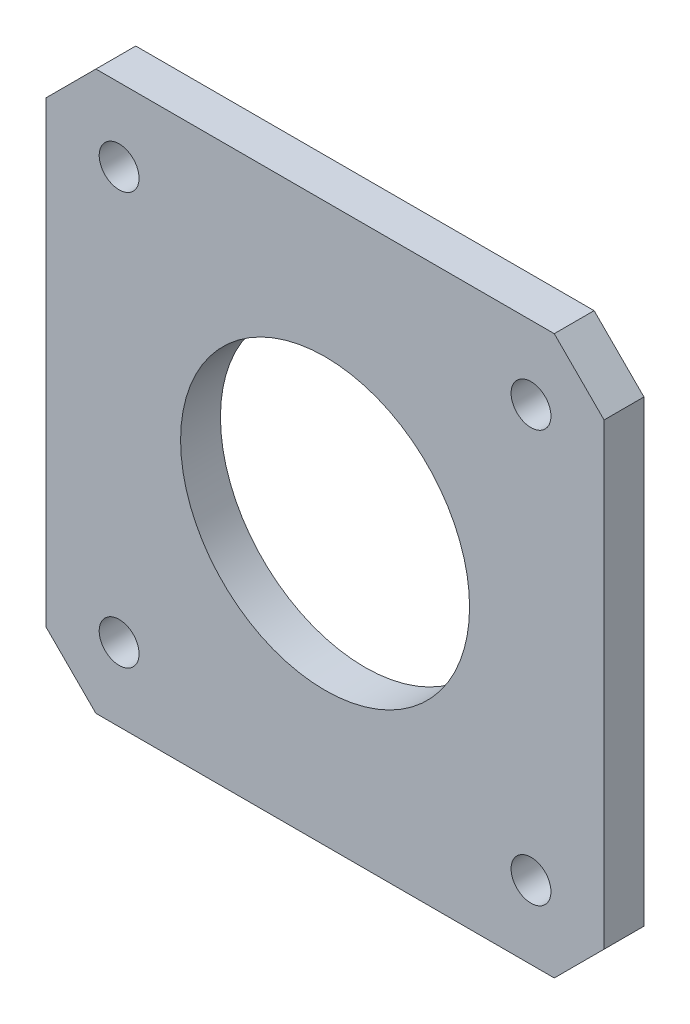
ISO-10303-21;
HEADER;
FILE_DESCRIPTION(('STEP AP214'),'2;1');
FILE_NAME('part.step','',(''),(''),'','','');
FILE_SCHEMA(('AUTOMOTIVE_DESIGN { 1 0 10303 214 1 1 1 1 }'));
ENDSEC;
DATA;
#1=APPLICATION_CONTEXT('core data for automotive mechanical design processes');
#2=APPLICATION_PROTOCOL_DEFINITION('international standard','automotive_design',2000,#1);
#3=PRODUCT_CONTEXT('',#1,'mechanical');
#4=PRODUCT('Part','Part','',(#3));
#5=PRODUCT_RELATED_PRODUCT_CATEGORY('part','',(#4));
#6=PRODUCT_DEFINITION_FORMATION('','',#4);
#7=PRODUCT_DEFINITION_CONTEXT('part definition',#1,'design');
#8=PRODUCT_DEFINITION('design','',#6,#7);
#9=PRODUCT_DEFINITION_SHAPE('','',#8);
#10=(LENGTH_UNIT() NAMED_UNIT(*) SI_UNIT(.MILLI.,.METRE.));
#11=(NAMED_UNIT(*) PLANE_ANGLE_UNIT() SI_UNIT($,.RADIAN.));
#12=(NAMED_UNIT(*) SI_UNIT($,.STERADIAN.) SOLID_ANGLE_UNIT());
#13=UNCERTAINTY_MEASURE_WITH_UNIT(LENGTH_MEASURE(1.E-05),#10,'distance_accuracy_value','');
#14=(GEOMETRIC_REPRESENTATION_CONTEXT(3) GLOBAL_UNCERTAINTY_ASSIGNED_CONTEXT((#13)) GLOBAL_UNIT_ASSIGNED_CONTEXT((#10,
#11,#12)) REPRESENTATION_CONTEXT('',''));
#15=CARTESIAN_POINT('',(0.,0.,0.));
#16=DIRECTION('',(0.,0.,1.));
#17=DIRECTION('',(1.,0.,0.));
#18=AXIS2_PLACEMENT_3D('',#15,#16,#17);
#19=CARTESIAN_POINT('',(0.,0.,3.));
#20=DIRECTION('',(0.,0.,1.));
#21=DIRECTION('',(1.,0.,0.));
#22=AXIS2_PLACEMENT_3D('',#19,#20,#21);
#23=PLANE('',#22);
#24=CARTESIAN_POINT('',(15.5000000000009,-15.4999999999991,3.));
#25=DIRECTION('',(0.,0.,1.));
#26=DIRECTION('',(1.,0.,0.));
#27=AXIS2_PLACEMENT_3D('',#24,#25,#26);
#28=CIRCLE('',#27,1.50000000000123);
#29=CARTESIAN_POINT('',(17.0000000000021,-15.4999999999991,3.));
#30=VERTEX_POINT('',#29);
#31=EDGE_CURVE('E186',#30,#30,#28,.T.);
#32=ORIENTED_EDGE('',*,*,#31,.F.);
#33=EDGE_LOOP('',(#32));
#34=FACE_BOUND('',#33,.T.);
#35=CARTESIAN_POINT('',(0.,0.,3.));
#36=DIRECTION('',(0.,0.,1.));
#37=DIRECTION('',(1.,0.,0.));
#38=AXIS2_PLACEMENT_3D('',#35,#36,#37);
#39=CIRCLE('',#38,10.875);
#40=CARTESIAN_POINT('',(10.875,0.,3.));
#41=VERTEX_POINT('',#40);
#42=EDGE_CURVE('E160',#41,#41,#39,.T.);
#43=ORIENTED_EDGE('',*,*,#42,.F.);
#44=EDGE_LOOP('',(#43));
#45=FACE_BOUND('',#44,.T.);
#46=DIRECTION('',(-1.,0.,0.));
#47=VECTOR('',#46,1.);
#48=CARTESIAN_POINT('',(-17.25,21.,3.));
#49=LINE('',#48,#47);
#50=CARTESIAN_POINT('',(17.25,21.,3.));
#51=VERTEX_POINT('',#50);
#52=CARTESIAN_POINT('',(-17.25,21.,3.));
#53=VERTEX_POINT('',#52);
#54=EDGE_CURVE('E161',#51,#53,#49,.T.);
#55=ORIENTED_EDGE('',*,*,#54,.T.);
#56=DIRECTION('',(-0.707106781186547,-0.707106781186547,0.));
#57=VECTOR('',#56,1.);
#58=CARTESIAN_POINT('',(-21.,17.25,3.));
#59=LINE('',#58,#57);
#60=CARTESIAN_POINT('',(-21.,17.25,3.));
#61=VERTEX_POINT('',#60);
#62=EDGE_CURVE('E98',#53,#61,#59,.T.);
#63=ORIENTED_EDGE('',*,*,#62,.T.);
#64=DIRECTION('',(0.,-1.,0.));
#65=VECTOR('',#64,1.);
#66=CARTESIAN_POINT('',(-21.,-17.25,3.));
#67=LINE('',#66,#65);
#68=CARTESIAN_POINT('',(-21.,-17.25,3.));
#69=VERTEX_POINT('',#68);
#70=EDGE_CURVE('E174',#61,#69,#67,.T.);
#71=ORIENTED_EDGE('',*,*,#70,.T.);
#72=DIRECTION('',(0.707106781186547,-0.707106781186547,0.));
#73=VECTOR('',#72,1.);
#74=CARTESIAN_POINT('',(-21.,-17.25,3.));
#75=LINE('',#74,#73);
#76=CARTESIAN_POINT('',(-17.25,-21.,3.));
#77=VERTEX_POINT('',#76);
#78=EDGE_CURVE('E177',#69,#77,#75,.T.);
#79=ORIENTED_EDGE('',*,*,#78,.T.);
#80=DIRECTION('',(1.,0.,0.));
#81=VECTOR('',#80,1.);
#82=CARTESIAN_POINT('',(-17.25,-21.,3.));
#83=LINE('',#82,#81);
#84=CARTESIAN_POINT('',(17.25,-21.,3.));
#85=VERTEX_POINT('',#84);
#86=EDGE_CURVE('E117',#77,#85,#83,.T.);
#87=ORIENTED_EDGE('',*,*,#86,.T.);
#88=DIRECTION('',(0.707106781186547,0.707106781186548,0.));
#89=VECTOR('',#88,1.);
#90=CARTESIAN_POINT('',(17.25,-21.,3.));
#91=LINE('',#90,#89);
#92=CARTESIAN_POINT('',(21.,-17.25,3.));
#93=VERTEX_POINT('',#92);
#94=EDGE_CURVE('E111',#85,#93,#91,.T.);
#95=ORIENTED_EDGE('',*,*,#94,.T.);
#96=DIRECTION('',(0.,1.,0.));
#97=VECTOR('',#96,1.);
#98=CARTESIAN_POINT('',(21.,-17.25,3.));
#99=LINE('',#98,#97);
#100=CARTESIAN_POINT('',(21.,17.25,3.));
#101=VERTEX_POINT('',#100);
#102=EDGE_CURVE('E115',#93,#101,#99,.T.);
#103=ORIENTED_EDGE('',*,*,#102,.T.);
#104=DIRECTION('',(-0.707106781186547,0.707106781186547,0.));
#105=VECTOR('',#104,1.);
#106=CARTESIAN_POINT('',(17.25,21.,3.));
#107=LINE('',#106,#105);
#108=EDGE_CURVE('E55',#101,#51,#107,.T.);
#109=ORIENTED_EDGE('',*,*,#108,.T.);
#110=EDGE_LOOP('',(#55,#63,#71,#79,#87,#95,#103,#109));
#111=FACE_BOUND('',#110,.T.);
#112=CARTESIAN_POINT('',(-15.5,15.5,3.));
#113=DIRECTION('',(0.,0.,1.));
#114=DIRECTION('',(1.,0.,0.));
#115=AXIS2_PLACEMENT_3D('',#112,#113,#114);
#116=CIRCLE('',#115,1.5);
#117=CARTESIAN_POINT('',(-14.,15.5,3.));
#118=VERTEX_POINT('',#117);
#119=EDGE_CURVE('E148',#118,#118,#116,.T.);
#120=ORIENTED_EDGE('',*,*,#119,.F.);
#121=EDGE_LOOP('',(#120));
#122=FACE_BOUND('',#121,.T.);
#123=CARTESIAN_POINT('',(15.5,15.5000000000009,3.));
#124=DIRECTION('',(0.,0.,1.));
#125=DIRECTION('',(1.,0.,0.));
#126=AXIS2_PLACEMENT_3D('',#123,#124,#125);
#127=CIRCLE('',#126,1.50000000000091);
#128=CARTESIAN_POINT('',(17.0000000000009,15.5000000000009,3.));
#129=VERTEX_POINT('',#128);
#130=EDGE_CURVE('E194',#129,#129,#127,.T.);
#131=ORIENTED_EDGE('',*,*,#130,.F.);
#132=EDGE_LOOP('',(#131));
#133=FACE_BOUND('',#132,.T.);
#134=CARTESIAN_POINT('',(-15.4999999999991,-15.5,3.));
#135=DIRECTION('',(0.,0.,1.));
#136=DIRECTION('',(1.,0.,0.));
#137=AXIS2_PLACEMENT_3D('',#134,#135,#136);
#138=CIRCLE('',#137,1.50000000000047);
#139=CARTESIAN_POINT('',(-13.9999999999986,-15.5,3.));
#140=VERTEX_POINT('',#139);
#141=EDGE_CURVE('E197',#140,#140,#138,.T.);
#142=ORIENTED_EDGE('',*,*,#141,.F.);
#143=EDGE_LOOP('',(#142));
#144=FACE_BOUND('',#143,.T.);
#145=ADVANCED_FACE('F38',(#34,#45,#111,#122,#133,#144),#23,.T.);
#146=CARTESIAN_POINT('',(0.,0.,0.));
#147=DIRECTION('',(0.,0.,1.));
#148=DIRECTION('',(1.,0.,0.));
#149=AXIS2_PLACEMENT_3D('',#146,#147,#148);
#150=PLANE('',#149);
#151=DIRECTION('',(-1.,0.,0.));
#152=VECTOR('',#151,1.);
#153=CARTESIAN_POINT('',(-17.25,21.,0.));
#154=LINE('',#153,#152);
#155=CARTESIAN_POINT('',(17.25,21.,0.));
#156=VERTEX_POINT('',#155);
#157=CARTESIAN_POINT('',(-17.25,21.,0.));
#158=VERTEX_POINT('',#157);
#159=EDGE_CURVE('E154',#156,#158,#154,.T.);
#160=ORIENTED_EDGE('',*,*,#159,.F.);
#161=DIRECTION('',(-0.707106781186547,0.707106781186547,0.));
#162=VECTOR('',#161,1.);
#163=CARTESIAN_POINT('',(17.25,21.,0.));
#164=LINE('',#163,#162);
#165=CARTESIAN_POINT('',(21.,17.25,0.));
#166=VERTEX_POINT('',#165);
#167=EDGE_CURVE('E90',#166,#156,#164,.T.);
#168=ORIENTED_EDGE('',*,*,#167,.F.);
#169=DIRECTION('',(0.,1.,0.));
#170=VECTOR('',#169,1.);
#171=CARTESIAN_POINT('',(21.,-17.25,0.));
#172=LINE('',#171,#170);
#173=CARTESIAN_POINT('',(21.,-17.25,0.));
#174=VERTEX_POINT('',#173);
#175=EDGE_CURVE('E84',#174,#166,#172,.T.);
#176=ORIENTED_EDGE('',*,*,#175,.F.);
#177=DIRECTION('',(0.707106781186547,0.707106781186548,0.));
#178=VECTOR('',#177,1.);
#179=CARTESIAN_POINT('',(17.25,-21.,0.));
#180=LINE('',#179,#178);
#181=CARTESIAN_POINT('',(17.25,-21.,0.));
#182=VERTEX_POINT('',#181);
#183=EDGE_CURVE('E126',#182,#174,#180,.T.);
#184=ORIENTED_EDGE('',*,*,#183,.F.);
#185=DIRECTION('',(1.,0.,0.));
#186=VECTOR('',#185,1.);
#187=CARTESIAN_POINT('',(-17.25,-21.,0.));
#188=LINE('',#187,#186);
#189=CARTESIAN_POINT('',(-17.25,-21.,0.));
#190=VERTEX_POINT('',#189);
#191=EDGE_CURVE('E280',#190,#182,#188,.T.);
#192=ORIENTED_EDGE('',*,*,#191,.F.);
#193=DIRECTION('',(0.707106781186547,-0.707106781186547,0.));
#194=VECTOR('',#193,1.);
#195=CARTESIAN_POINT('',(-21.,-17.25,0.));
#196=LINE('',#195,#194);
#197=CARTESIAN_POINT('',(-21.,-17.25,0.));
#198=VERTEX_POINT('',#197);
#199=EDGE_CURVE('E278',#198,#190,#196,.T.);
#200=ORIENTED_EDGE('',*,*,#199,.F.);
#201=DIRECTION('',(0.,-1.,0.));
#202=VECTOR('',#201,1.);
#203=CARTESIAN_POINT('',(-21.,-17.25,0.));
#204=LINE('',#203,#202);
#205=CARTESIAN_POINT('',(-21.,17.25,0.));
#206=VERTEX_POINT('',#205);
#207=EDGE_CURVE('E270',#206,#198,#204,.T.);
#208=ORIENTED_EDGE('',*,*,#207,.F.);
#209=DIRECTION('',(-0.707106781186547,-0.707106781186547,0.));
#210=VECTOR('',#209,1.);
#211=CARTESIAN_POINT('',(-21.,17.25,0.));
#212=LINE('',#211,#210);
#213=EDGE_CURVE('E263',#158,#206,#212,.T.);
#214=ORIENTED_EDGE('',*,*,#213,.F.);
#215=EDGE_LOOP('',(#160,#168,#176,#184,#192,#200,#208,#214));
#216=FACE_BOUND('',#215,.T.);
#217=CARTESIAN_POINT('',(-15.5,15.5,0.));
#218=DIRECTION('',(0.,0.,1.));
#219=DIRECTION('',(1.,0.,0.));
#220=AXIS2_PLACEMENT_3D('',#217,#218,#219);
#221=CIRCLE('',#220,1.5);
#222=CARTESIAN_POINT('',(-14.,15.5,0.));
#223=VERTEX_POINT('',#222);
#224=EDGE_CURVE('E155',#223,#223,#221,.T.);
#225=ORIENTED_EDGE('',*,*,#224,.T.);
#226=EDGE_LOOP('',(#225));
#227=FACE_BOUND('',#226,.T.);
#228=CARTESIAN_POINT('',(0.,0.,0.));
#229=DIRECTION('',(0.,0.,1.));
#230=DIRECTION('',(1.,0.,0.));
#231=AXIS2_PLACEMENT_3D('',#228,#229,#230);
#232=CIRCLE('',#231,10.875);
#233=CARTESIAN_POINT('',(10.875,0.,0.));
#234=VERTEX_POINT('',#233);
#235=EDGE_CURVE('E156',#234,#234,#232,.T.);
#236=ORIENTED_EDGE('',*,*,#235,.T.);
#237=EDGE_LOOP('',(#236));
#238=FACE_BOUND('',#237,.T.);
#239=CARTESIAN_POINT('',(15.5,15.5000000000009,0.));
#240=DIRECTION('',(0.,0.,1.));
#241=DIRECTION('',(1.,0.,0.));
#242=AXIS2_PLACEMENT_3D('',#239,#240,#241);
#243=CIRCLE('',#242,1.50000000000091);
#244=CARTESIAN_POINT('',(17.0000000000009,15.5000000000009,0.));
#245=VERTEX_POINT('',#244);
#246=EDGE_CURVE('E188',#245,#245,#243,.T.);
#247=ORIENTED_EDGE('',*,*,#246,.T.);
#248=EDGE_LOOP('',(#247));
#249=FACE_BOUND('',#248,.T.);
#250=CARTESIAN_POINT('',(15.5000000000009,-15.4999999999991,0.));
#251=DIRECTION('',(0.,0.,1.));
#252=DIRECTION('',(1.,0.,0.));
#253=AXIS2_PLACEMENT_3D('',#250,#251,#252);
#254=CIRCLE('',#253,1.50000000000123);
#255=CARTESIAN_POINT('',(17.0000000000021,-15.4999999999991,0.));
#256=VERTEX_POINT('',#255);
#257=EDGE_CURVE('E189',#256,#256,#254,.T.);
#258=ORIENTED_EDGE('',*,*,#257,.T.);
#259=EDGE_LOOP('',(#258));
#260=FACE_BOUND('',#259,.T.);
#261=CARTESIAN_POINT('',(-15.4999999999991,-15.5,0.));
#262=DIRECTION('',(0.,0.,1.));
#263=DIRECTION('',(1.,0.,0.));
#264=AXIS2_PLACEMENT_3D('',#261,#262,#263);
#265=CIRCLE('',#264,1.50000000000047);
#266=CARTESIAN_POINT('',(-13.9999999999986,-15.5,0.));
#267=VERTEX_POINT('',#266);
#268=EDGE_CURVE('E201',#267,#267,#265,.T.);
#269=ORIENTED_EDGE('',*,*,#268,.T.);
#270=EDGE_LOOP('',(#269));
#271=FACE_BOUND('',#270,.T.);
#272=ADVANCED_FACE('F212',(#216,#227,#238,#249,#260,#271),#150,.F.);
#273=CARTESIAN_POINT('',(-17.25,21.,3.));
#274=DIRECTION('',(0.,-1.,0.));
#275=DIRECTION('',(0.,0.,-1.));
#276=AXIS2_PLACEMENT_3D('',#273,#274,#275);
#277=PLANE('',#276);
#278=ORIENTED_EDGE('',*,*,#159,.T.);
#279=DIRECTION('',(0.,0.,-1.));
#280=VECTOR('',#279,1.);
#281=CARTESIAN_POINT('',(-17.25,21.,3.));
#282=LINE('',#281,#280);
#283=EDGE_CURVE('E12',#53,#158,#282,.T.);
#284=ORIENTED_EDGE('',*,*,#283,.F.);
#285=ORIENTED_EDGE('',*,*,#54,.F.);
#286=DIRECTION('',(0.,0.,-1.));
#287=VECTOR('',#286,1.);
#288=CARTESIAN_POINT('',(17.25,21.,3.));
#289=LINE('',#288,#287);
#290=EDGE_CURVE('E134',#51,#156,#289,.T.);
#291=ORIENTED_EDGE('',*,*,#290,.T.);
#292=EDGE_LOOP('',(#278,#284,#285,#291));
#293=FACE_BOUND('',#292,.T.);
#294=ADVANCED_FACE('F40',(#293),#277,.F.);
#295=CARTESIAN_POINT('',(-21.,17.25,3.));
#296=DIRECTION('',(0.707106781186548,-0.707106781186548,0.));
#297=DIRECTION('',(0.707106781186548,0.707106781186548,0.));
#298=AXIS2_PLACEMENT_3D('',#295,#296,#297);
#299=PLANE('',#298);
#300=ORIENTED_EDGE('',*,*,#213,.T.);
#301=DIRECTION('',(0.,0.,-1.));
#302=VECTOR('',#301,1.);
#303=CARTESIAN_POINT('',(-21.,17.25,3.));
#304=LINE('',#303,#302);
#305=EDGE_CURVE('E47',#61,#206,#304,.T.);
#306=ORIENTED_EDGE('',*,*,#305,.F.);
#307=ORIENTED_EDGE('',*,*,#62,.F.);
#308=ORIENTED_EDGE('',*,*,#283,.T.);
#309=EDGE_LOOP('',(#300,#306,#307,#308));
#310=FACE_BOUND('',#309,.T.);
#311=ADVANCED_FACE('F256',(#310),#299,.F.);
#312=CARTESIAN_POINT('',(-21.,-17.25,3.));
#313=DIRECTION('',(1.,0.,0.));
#314=DIRECTION('',(0.,0.,-1.));
#315=AXIS2_PLACEMENT_3D('',#312,#313,#314);
#316=PLANE('',#315);
#317=ORIENTED_EDGE('',*,*,#207,.T.);
#318=DIRECTION('',(0.,0.,-1.));
#319=VECTOR('',#318,1.);
#320=CARTESIAN_POINT('',(-21.,-17.25,3.));
#321=LINE('',#320,#319);
#322=EDGE_CURVE('E274',#69,#198,#321,.T.);
#323=ORIENTED_EDGE('',*,*,#322,.F.);
#324=ORIENTED_EDGE('',*,*,#70,.F.);
#325=ORIENTED_EDGE('',*,*,#305,.T.);
#326=EDGE_LOOP('',(#317,#323,#324,#325));
#327=FACE_BOUND('',#326,.T.);
#328=ADVANCED_FACE('F253',(#327),#316,.F.);
#329=CARTESIAN_POINT('',(-21.,-17.25,3.));
#330=DIRECTION('',(0.707106781186548,0.707106781186548,0.));
#331=DIRECTION('',(-0.707106781186548,0.707106781186548,0.));
#332=AXIS2_PLACEMENT_3D('',#329,#330,#331);
#333=PLANE('',#332);
#334=ORIENTED_EDGE('',*,*,#199,.T.);
#335=DIRECTION('',(0.,0.,-1.));
#336=VECTOR('',#335,1.);
#337=CARTESIAN_POINT('',(-17.25,-21.,3.));
#338=LINE('',#337,#336);
#339=EDGE_CURVE('E290',#77,#190,#338,.T.);
#340=ORIENTED_EDGE('',*,*,#339,.F.);
#341=ORIENTED_EDGE('',*,*,#78,.F.);
#342=ORIENTED_EDGE('',*,*,#322,.T.);
#343=EDGE_LOOP('',(#334,#340,#341,#342));
#344=FACE_BOUND('',#343,.T.);
#345=ADVANCED_FACE('F249',(#344),#333,.F.);
#346=CARTESIAN_POINT('',(-17.25,-21.,3.));
#347=DIRECTION('',(0.,1.,0.));
#348=DIRECTION('',(0.,0.,1.));
#349=AXIS2_PLACEMENT_3D('',#346,#347,#348);
#350=PLANE('',#349);
#351=ORIENTED_EDGE('',*,*,#191,.T.);
#352=DIRECTION('',(0.,0.,-1.));
#353=VECTOR('',#352,1.);
#354=CARTESIAN_POINT('',(17.25,-21.,3.));
#355=LINE('',#354,#353);
#356=EDGE_CURVE('E127',#85,#182,#355,.T.);
#357=ORIENTED_EDGE('',*,*,#356,.F.);
#358=ORIENTED_EDGE('',*,*,#86,.F.);
#359=ORIENTED_EDGE('',*,*,#339,.T.);
#360=EDGE_LOOP('',(#351,#357,#358,#359));
#361=FACE_BOUND('',#360,.T.);
#362=ADVANCED_FACE('F246',(#361),#350,.F.);
#363=CARTESIAN_POINT('',(17.25,-21.,3.));
#364=DIRECTION('',(-0.707106781186548,0.707106781186547,0.));
#365=DIRECTION('',(-0.707106781186547,-0.707106781186548,0.));
#366=AXIS2_PLACEMENT_3D('',#363,#364,#365);
#367=PLANE('',#366);
#368=ORIENTED_EDGE('',*,*,#183,.T.);
#369=DIRECTION('',(0.,0.,-1.));
#370=VECTOR('',#369,1.);
#371=CARTESIAN_POINT('',(21.,-17.25,3.));
#372=LINE('',#371,#370);
#373=EDGE_CURVE('E123',#93,#174,#372,.T.);
#374=ORIENTED_EDGE('',*,*,#373,.F.);
#375=ORIENTED_EDGE('',*,*,#94,.F.);
#376=ORIENTED_EDGE('',*,*,#356,.T.);
#377=EDGE_LOOP('',(#368,#374,#375,#376));
#378=FACE_BOUND('',#377,.T.);
#379=ADVANCED_FACE('F124',(#378),#367,.F.);
#380=CARTESIAN_POINT('',(21.,-17.25,3.));
#381=DIRECTION('',(-1.,0.,0.));
#382=DIRECTION('',(0.,0.,1.));
#383=AXIS2_PLACEMENT_3D('',#380,#381,#382);
#384=PLANE('',#383);
#385=ORIENTED_EDGE('',*,*,#175,.T.);
#386=DIRECTION('',(0.,0.,-1.));
#387=VECTOR('',#386,1.);
#388=CARTESIAN_POINT('',(21.,17.25,3.));
#389=LINE('',#388,#387);
#390=EDGE_CURVE('E128',#101,#166,#389,.T.);
#391=ORIENTED_EDGE('',*,*,#390,.F.);
#392=ORIENTED_EDGE('',*,*,#102,.F.);
#393=ORIENTED_EDGE('',*,*,#373,.T.);
#394=EDGE_LOOP('',(#385,#391,#392,#393));
#395=FACE_BOUND('',#394,.T.);
#396=ADVANCED_FACE('F130',(#395),#384,.F.);
#397=CARTESIAN_POINT('',(17.25,21.,3.));
#398=DIRECTION('',(-0.707106781186548,-0.707106781186548,0.));
#399=DIRECTION('',(0.707106781186548,-0.707106781186548,0.));
#400=AXIS2_PLACEMENT_3D('',#397,#398,#399);
#401=PLANE('',#400);
#402=ORIENTED_EDGE('',*,*,#167,.T.);
#403=ORIENTED_EDGE('',*,*,#290,.F.);
#404=ORIENTED_EDGE('',*,*,#108,.F.);
#405=ORIENTED_EDGE('',*,*,#390,.T.);
#406=EDGE_LOOP('',(#402,#403,#404,#405));
#407=FACE_BOUND('',#406,.T.);
#408=ADVANCED_FACE('F227',(#407),#401,.F.);
#409=CARTESIAN_POINT('',(-15.5,15.5,3.));
#410=DIRECTION('',(0.,0.,-1.));
#411=DIRECTION('',(-1.,0.,0.));
#412=AXIS2_PLACEMENT_3D('',#409,#410,#411);
#413=CYLINDRICAL_SURFACE('',#412,1.5);
#414=ORIENTED_EDGE('',*,*,#119,.T.);
#415=EDGE_LOOP('',(#414));
#416=FACE_BOUND('',#415,.T.);
#417=ORIENTED_EDGE('',*,*,#224,.F.);
#418=EDGE_LOOP('',(#417));
#419=FACE_BOUND('',#418,.T.);
#420=ADVANCED_FACE('F218',(#416,#419),#413,.F.);
#421=CARTESIAN_POINT('',(0.,0.,3.));
#422=DIRECTION('',(0.,0.,-1.));
#423=DIRECTION('',(-1.,0.,0.));
#424=AXIS2_PLACEMENT_3D('',#421,#422,#423);
#425=CYLINDRICAL_SURFACE('',#424,10.875);
#426=ORIENTED_EDGE('',*,*,#42,.T.);
#427=EDGE_LOOP('',(#426));
#428=FACE_BOUND('',#427,.T.);
#429=ORIENTED_EDGE('',*,*,#235,.F.);
#430=EDGE_LOOP('',(#429));
#431=FACE_BOUND('',#430,.T.);
#432=ADVANCED_FACE('F215',(#428,#431),#425,.F.);
#433=CARTESIAN_POINT('',(15.5,15.5000000000009,3.));
#434=DIRECTION('',(0.,0.,-1.));
#435=DIRECTION('',(-1.,0.,0.));
#436=AXIS2_PLACEMENT_3D('',#433,#434,#435);
#437=CYLINDRICAL_SURFACE('',#436,1.50000000000091);
#438=ORIENTED_EDGE('',*,*,#130,.T.);
#439=EDGE_LOOP('',(#438));
#440=FACE_BOUND('',#439,.T.);
#441=ORIENTED_EDGE('',*,*,#246,.F.);
#442=EDGE_LOOP('',(#441));
#443=FACE_BOUND('',#442,.T.);
#444=ADVANCED_FACE('F217',(#440,#443),#437,.F.);
#445=CARTESIAN_POINT('',(15.5000000000009,-15.4999999999991,3.));
#446=DIRECTION('',(0.,0.,-1.));
#447=DIRECTION('',(-1.,0.,0.));
#448=AXIS2_PLACEMENT_3D('',#445,#446,#447);
#449=CYLINDRICAL_SURFACE('',#448,1.50000000000123);
#450=ORIENTED_EDGE('',*,*,#31,.T.);
#451=EDGE_LOOP('',(#450));
#452=FACE_BOUND('',#451,.T.);
#453=ORIENTED_EDGE('',*,*,#257,.F.);
#454=EDGE_LOOP('',(#453));
#455=FACE_BOUND('',#454,.T.);
#456=ADVANCED_FACE('F225',(#452,#455),#449,.F.);
#457=CARTESIAN_POINT('',(-15.4999999999991,-15.5,3.));
#458=DIRECTION('',(0.,0.,-1.));
#459=DIRECTION('',(-1.,0.,0.));
#460=AXIS2_PLACEMENT_3D('',#457,#458,#459);
#461=CYLINDRICAL_SURFACE('',#460,1.50000000000047);
#462=ORIENTED_EDGE('',*,*,#141,.T.);
#463=EDGE_LOOP('',(#462));
#464=FACE_BOUND('',#463,.T.);
#465=ORIENTED_EDGE('',*,*,#268,.F.);
#466=EDGE_LOOP('',(#465));
#467=FACE_BOUND('',#466,.T.);
#468=ADVANCED_FACE('F368',(#464,#467),#461,.F.);
#469=CLOSED_SHELL('',(#145,#272,#294,#311,#328,#345,#362,#379,#396,#408,#420,#432,#444,#456,#468));
#470=MANIFOLD_SOLID_BREP('B2',#469);
#471=ADVANCED_BREP_SHAPE_REPRESENTATION('',(#18,#470),#14);
#472=SHAPE_DEFINITION_REPRESENTATION(#9,#471);
ENDSEC;
END-ISO-10303-21;
